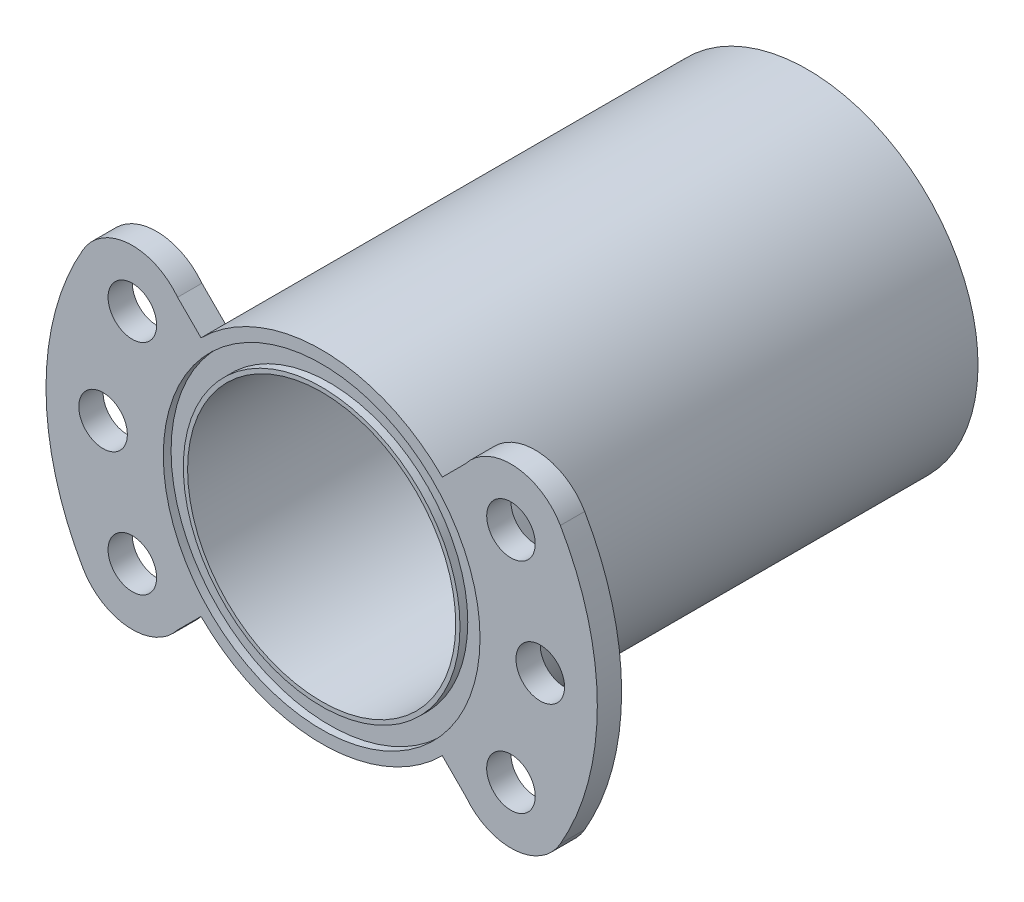
ISO-10303-21;
HEADER;
FILE_DESCRIPTION(('STEP AP214'),'2;1');
FILE_NAME('part.step','',(''),(''),'','','');
FILE_SCHEMA(('AUTOMOTIVE_DESIGN { 1 0 10303 214 1 1 1 1 }'));
ENDSEC;
DATA;
#1=APPLICATION_CONTEXT('core data for automotive mechanical design processes');
#2=APPLICATION_PROTOCOL_DEFINITION('international standard','automotive_design',2000,#1);
#3=PRODUCT_CONTEXT('',#1,'mechanical');
#4=PRODUCT('Part','Part','',(#3));
#5=PRODUCT_RELATED_PRODUCT_CATEGORY('part','',(#4));
#6=PRODUCT_DEFINITION_FORMATION('','',#4);
#7=PRODUCT_DEFINITION_CONTEXT('part definition',#1,'design');
#8=PRODUCT_DEFINITION('design','',#6,#7);
#9=PRODUCT_DEFINITION_SHAPE('','',#8);
#10=(LENGTH_UNIT() NAMED_UNIT(*) SI_UNIT(.MILLI.,.METRE.));
#11=(NAMED_UNIT(*) PLANE_ANGLE_UNIT() SI_UNIT($,.RADIAN.));
#12=(NAMED_UNIT(*) SI_UNIT($,.STERADIAN.) SOLID_ANGLE_UNIT());
#13=UNCERTAINTY_MEASURE_WITH_UNIT(LENGTH_MEASURE(1.E-05),#10,'distance_accuracy_value','');
#14=(GEOMETRIC_REPRESENTATION_CONTEXT(3) GLOBAL_UNCERTAINTY_ASSIGNED_CONTEXT((#13)) GLOBAL_UNIT_ASSIGNED_CONTEXT((#10,
#11,#12)) REPRESENTATION_CONTEXT('',''));
#15=CARTESIAN_POINT('',(0.,0.,0.));
#16=DIRECTION('',(0.,0.,1.));
#17=DIRECTION('',(1.,0.,0.));
#18=AXIS2_PLACEMENT_3D('',#15,#16,#17);
#19=CARTESIAN_POINT('',(0.,0.,254.));
#20=DIRECTION('',(0.,0.,-1.));
#21=DIRECTION('',(-1.,0.,0.));
#22=AXIS2_PLACEMENT_3D('',#19,#20,#21);
#23=CYLINDRICAL_SURFACE('',#22,17.526);
#24=CARTESIAN_POINT('',(0.,0.,127.));
#25=DIRECTION('',(0.,0.,1.));
#26=DIRECTION('',(1.,0.,0.));
#27=AXIS2_PLACEMENT_3D('',#24,#25,#26);
#28=CIRCLE('',#27,17.526);
#29=CARTESIAN_POINT('',(17.526,0.,127.));
#30=VERTEX_POINT('',#29);
#31=EDGE_CURVE('E51',#30,#30,#28,.T.);
#32=ORIENTED_EDGE('',*,*,#31,.T.);
#33=EDGE_LOOP('',(#32));
#34=FACE_BOUND('',#33,.T.);
#35=CARTESIAN_POINT('',(0.,0.,66.675));
#36=DIRECTION('',(0.,0.,-1.));
#37=DIRECTION('',(-1.,0.,0.));
#38=AXIS2_PLACEMENT_3D('',#35,#36,#37);
#39=CIRCLE('',#38,17.526);
#40=CARTESIAN_POINT('',(-17.526,0.,66.675));
#41=VERTEX_POINT('',#40);
#42=EDGE_CURVE('E46',#41,#41,#39,.T.);
#43=ORIENTED_EDGE('',*,*,#42,.T.);
#44=EDGE_LOOP('',(#43));
#45=FACE_BOUND('',#44,.T.);
#46=ADVANCED_FACE('F43',(#34,#45),#23,.F.);
#47=CARTESIAN_POINT('',(0.,0.,60.7476810056103));
#48=DIRECTION('',(0.,0.,1.));
#49=DIRECTION('',(1.,0.,0.));
#50=AXIS2_PLACEMENT_3D('',#47,#48,#49);
#51=CYLINDRICAL_SURFACE('',#50,22.3012);
#52=DIRECTION('',(0.,0.,1.));
#53=VECTOR('',#52,1.);
#54=CARTESIAN_POINT('',(-15.7693297485973,-15.7693297485976,60.7476810056103));
#55=LINE('',#54,#53);
#56=CARTESIAN_POINT('',(-15.7693297485973,-15.7693297485976,123.825));
#57=VERTEX_POINT('',#56);
#58=CARTESIAN_POINT('',(-15.7693297485973,-15.7693297485976,127.));
#59=VERTEX_POINT('',#58);
#60=EDGE_CURVE('E59',#57,#59,#55,.T.);
#61=ORIENTED_EDGE('',*,*,#60,.F.);
#62=CARTESIAN_POINT('',(0.,0.,123.825));
#63=DIRECTION('',(0.,0.,1.));
#64=DIRECTION('',(1.,0.,0.));
#65=AXIS2_PLACEMENT_3D('',#62,#63,#64);
#66=CIRCLE('',#65,22.3012);
#67=CARTESIAN_POINT('',(-15.7693297485975,15.7693297485974,123.825));
#68=VERTEX_POINT('',#67);
#69=EDGE_CURVE('E143',#68,#57,#66,.T.);
#70=ORIENTED_EDGE('',*,*,#69,.F.);
#71=DIRECTION('',(0.,0.,1.));
#72=VECTOR('',#71,1.);
#73=CARTESIAN_POINT('',(-15.7693297485975,15.7693297485974,60.7476810056103));
#74=LINE('',#73,#72);
#75=CARTESIAN_POINT('',(-15.7693297485975,15.7693297485974,127.));
#76=VERTEX_POINT('',#75);
#77=EDGE_CURVE('E12',#68,#76,#74,.T.);
#78=ORIENTED_EDGE('',*,*,#77,.T.);
#79=CARTESIAN_POINT('',(0.,0.,127.));
#80=DIRECTION('',(0.,0.,1.));
#81=DIRECTION('',(1.,0.,0.));
#82=AXIS2_PLACEMENT_3D('',#79,#80,#81);
#83=CIRCLE('',#82,22.3012);
#84=CARTESIAN_POINT('',(15.7693297485974,15.7693297485975,127.));
#85=VERTEX_POINT('',#84);
#86=EDGE_CURVE('E159',#85,#76,#83,.T.);
#87=ORIENTED_EDGE('',*,*,#86,.F.);
#88=DIRECTION('',(0.,0.,1.));
#89=VECTOR('',#88,1.);
#90=CARTESIAN_POINT('',(15.7693297485974,15.7693297485975,60.7476810056103));
#91=LINE('',#90,#89);
#92=CARTESIAN_POINT('',(15.7693297485974,15.7693297485975,123.825));
#93=VERTEX_POINT('',#92);
#94=EDGE_CURVE('E150',#93,#85,#91,.T.);
#95=ORIENTED_EDGE('',*,*,#94,.F.);
#96=CARTESIAN_POINT('',(15.7693297485976,-15.7693297485972,123.825));
#97=VERTEX_POINT('',#96);
#98=EDGE_CURVE('E134',#97,#93,#66,.T.);
#99=ORIENTED_EDGE('',*,*,#98,.F.);
#100=DIRECTION('',(0.,0.,1.));
#101=VECTOR('',#100,1.);
#102=CARTESIAN_POINT('',(15.7693297485976,-15.7693297485972,60.7476810056103));
#103=LINE('',#102,#101);
#104=CARTESIAN_POINT('',(15.7693297485976,-15.7693297485972,127.));
#105=VERTEX_POINT('',#104);
#106=EDGE_CURVE('E67',#97,#105,#103,.T.);
#107=ORIENTED_EDGE('',*,*,#106,.T.);
#108=EDGE_CURVE('E162',#59,#105,#83,.T.);
#109=ORIENTED_EDGE('',*,*,#108,.F.);
#110=EDGE_LOOP('',(#61,#70,#78,#87,#95,#99,#107,#109));
#111=FACE_BOUND('',#110,.T.);
#112=CARTESIAN_POINT('',(0.,0.,63.5));
#113=DIRECTION('',(0.,0.,-1.));
#114=DIRECTION('',(-1.,0.,0.));
#115=AXIS2_PLACEMENT_3D('',#112,#113,#114);
#116=CIRCLE('',#115,22.3012);
#117=CARTESIAN_POINT('',(-22.3012,0.,63.5));
#118=VERTEX_POINT('',#117);
#119=EDGE_CURVE('E144',#118,#118,#116,.F.);
#120=ORIENTED_EDGE('',*,*,#119,.T.);
#121=EDGE_LOOP('',(#120));
#122=FACE_BOUND('',#121,.T.);
#123=ADVANCED_FACE('F156',(#111,#122),#51,.T.);
#124=CARTESIAN_POINT('',(24.7466759131402,14.2875000000003,-6.34999999999999));
#125=DIRECTION('',(0.,0.,1.));
#126=DIRECTION('',(1.,0.,0.));
#127=AXIS2_PLACEMENT_3D('',#124,#125,#126);
#128=CYLINDRICAL_SURFACE('',#127,3.175);
#129=CARTESIAN_POINT('',(24.7466759131402,14.2875000000003,123.825));
#130=DIRECTION('',(0.,0.,1.));
#131=DIRECTION('',(1.,0.,0.));
#132=AXIS2_PLACEMENT_3D('',#129,#130,#131);
#133=CIRCLE('',#132,3.175);
#134=CARTESIAN_POINT('',(27.9216759131402,14.2875000000003,123.825));
#135=VERTEX_POINT('',#134);
#136=EDGE_CURVE('E408',#135,#135,#133,.F.);
#137=ORIENTED_EDGE('',*,*,#136,.T.);
#138=EDGE_LOOP('',(#137));
#139=FACE_BOUND('',#138,.T.);
#140=CARTESIAN_POINT('',(24.7466759131402,14.2875000000003,127.));
#141=DIRECTION('',(0.,0.,1.));
#142=DIRECTION('',(0.50000000000001,-0.866025403784433,0.));
#143=AXIS2_PLACEMENT_3D('',#140,#141,#142);
#144=CIRCLE('',#143,3.175);
#145=CARTESIAN_POINT('',(26.3341759131402,11.5378693429847,127.));
#146=VERTEX_POINT('',#145);
#147=EDGE_CURVE('E208',#146,#146,#144,.T.);
#148=ORIENTED_EDGE('',*,*,#147,.T.);
#149=EDGE_LOOP('',(#148));
#150=FACE_BOUND('',#149,.T.);
#151=ADVANCED_FACE('F263',(#139,#150),#128,.F.);
#152=CARTESIAN_POINT('',(28.575,2.99307237772328E-13,-6.34999999999999));
#153=DIRECTION('',(0.,0.,1.));
#154=DIRECTION('',(1.,0.,0.));
#155=AXIS2_PLACEMENT_3D('',#152,#153,#154);
#156=CYLINDRICAL_SURFACE('',#155,3.175);
#157=CARTESIAN_POINT('',(28.575,2.99307237772328E-13,123.825));
#158=DIRECTION('',(0.,0.,1.));
#159=DIRECTION('',(1.,0.,0.));
#160=AXIS2_PLACEMENT_3D('',#157,#158,#159);
#161=CIRCLE('',#160,3.175);
#162=CARTESIAN_POINT('',(31.75,2.99307237772328E-13,123.825));
#163=VERTEX_POINT('',#162);
#164=EDGE_CURVE('E406',#163,#163,#161,.F.);
#165=ORIENTED_EDGE('',*,*,#164,.T.);
#166=EDGE_LOOP('',(#165));
#167=FACE_BOUND('',#166,.T.);
#168=CARTESIAN_POINT('',(28.575,2.99307237772328E-13,127.));
#169=DIRECTION('',(0.,0.,1.));
#170=DIRECTION('',(0.,-1.,0.));
#171=AXIS2_PLACEMENT_3D('',#168,#169,#170);
#172=CIRCLE('',#171,3.175);
#173=CARTESIAN_POINT('',(28.575,-3.1749999999997,127.));
#174=VERTEX_POINT('',#173);
#175=EDGE_CURVE('E225',#174,#174,#172,.T.);
#176=ORIENTED_EDGE('',*,*,#175,.T.);
#177=EDGE_LOOP('',(#176));
#178=FACE_BOUND('',#177,.T.);
#179=ADVANCED_FACE('F329',(#167,#178),#156,.F.);
#180=CARTESIAN_POINT('',(24.7466759131405,-14.2874999999998,-6.34999999999999));
#181=DIRECTION('',(0.,0.,1.));
#182=DIRECTION('',(1.,0.,0.));
#183=AXIS2_PLACEMENT_3D('',#180,#181,#182);
#184=CYLINDRICAL_SURFACE('',#183,3.175);
#185=CARTESIAN_POINT('',(24.7466759131405,-14.2874999999998,123.825));
#186=DIRECTION('',(0.,0.,1.));
#187=DIRECTION('',(1.,0.,0.));
#188=AXIS2_PLACEMENT_3D('',#185,#186,#187);
#189=CIRCLE('',#188,3.175);
#190=CARTESIAN_POINT('',(27.9216759131405,-14.2874999999998,123.825));
#191=VERTEX_POINT('',#190);
#192=EDGE_CURVE('E403',#191,#191,#189,.F.);
#193=ORIENTED_EDGE('',*,*,#192,.T.);
#194=EDGE_LOOP('',(#193));
#195=FACE_BOUND('',#194,.T.);
#196=CARTESIAN_POINT('',(24.7466759131405,-14.2874999999998,127.));
#197=DIRECTION('',(0.,0.,1.));
#198=DIRECTION('',(-0.499999999999992,-0.866025403784443,0.));
#199=AXIS2_PLACEMENT_3D('',#196,#197,#198);
#200=CIRCLE('',#199,3.175);
#201=CARTESIAN_POINT('',(23.1591759131405,-17.0371306570154,127.));
#202=VERTEX_POINT('',#201);
#203=EDGE_CURVE('E235',#202,#202,#200,.T.);
#204=ORIENTED_EDGE('',*,*,#203,.T.);
#205=EDGE_LOOP('',(#204));
#206=FACE_BOUND('',#205,.T.);
#207=ADVANCED_FACE('F341',(#195,#206),#184,.F.);
#208=CARTESIAN_POINT('',(-24.7466759131403,-14.2875000000001,-6.34999999999999));
#209=DIRECTION('',(0.,0.,1.));
#210=DIRECTION('',(1.,0.,0.));
#211=AXIS2_PLACEMENT_3D('',#208,#209,#210);
#212=CYLINDRICAL_SURFACE('',#211,3.175);
#213=CARTESIAN_POINT('',(-24.7466759131403,-14.2875000000001,123.825));
#214=DIRECTION('',(0.,0.,1.));
#215=DIRECTION('',(1.,0.,0.));
#216=AXIS2_PLACEMENT_3D('',#213,#214,#215);
#217=CIRCLE('',#216,3.175);
#218=CARTESIAN_POINT('',(-21.5716759131403,-14.2875000000001,123.825));
#219=VERTEX_POINT('',#218);
#220=EDGE_CURVE('E400',#219,#219,#217,.F.);
#221=ORIENTED_EDGE('',*,*,#220,.T.);
#222=EDGE_LOOP('',(#221));
#223=FACE_BOUND('',#222,.T.);
#224=CARTESIAN_POINT('',(-24.7466759131403,-14.2875000000001,127.));
#225=DIRECTION('',(0.,0.,1.));
#226=DIRECTION('',(-0.500000000000004,0.866025403784436,0.));
#227=AXIS2_PLACEMENT_3D('',#224,#225,#226);
#228=CIRCLE('',#227,3.175);
#229=CARTESIAN_POINT('',(-26.3341759131403,-11.5378693429845,127.));
#230=VERTEX_POINT('',#229);
#231=EDGE_CURVE('E232',#230,#230,#228,.T.);
#232=ORIENTED_EDGE('',*,*,#231,.T.);
#233=EDGE_LOOP('',(#232));
#234=FACE_BOUND('',#233,.T.);
#235=ADVANCED_FACE('F337',(#223,#234),#212,.F.);
#236=CARTESIAN_POINT('',(-28.575,0.,-6.34999999999999));
#237=DIRECTION('',(0.,0.,1.));
#238=DIRECTION('',(1.,0.,0.));
#239=AXIS2_PLACEMENT_3D('',#236,#237,#238);
#240=CYLINDRICAL_SURFACE('',#239,3.175);
#241=CARTESIAN_POINT('',(-28.575,0.,123.825));
#242=DIRECTION('',(0.,0.,1.));
#243=DIRECTION('',(1.,0.,0.));
#244=AXIS2_PLACEMENT_3D('',#241,#242,#243);
#245=CIRCLE('',#244,3.175);
#246=CARTESIAN_POINT('',(-25.4,0.,123.825));
#247=VERTEX_POINT('',#246);
#248=EDGE_CURVE('E397',#247,#247,#245,.F.);
#249=ORIENTED_EDGE('',*,*,#248,.T.);
#250=EDGE_LOOP('',(#249));
#251=FACE_BOUND('',#250,.T.);
#252=CARTESIAN_POINT('',(-28.575,0.,127.));
#253=DIRECTION('',(0.,0.,1.));
#254=DIRECTION('',(0.,1.,0.));
#255=AXIS2_PLACEMENT_3D('',#252,#253,#254);
#256=CIRCLE('',#255,3.175);
#257=CARTESIAN_POINT('',(-28.575,3.1749999999999,127.));
#258=VERTEX_POINT('',#257);
#259=EDGE_CURVE('E229',#258,#258,#256,.T.);
#260=ORIENTED_EDGE('',*,*,#259,.T.);
#261=EDGE_LOOP('',(#260));
#262=FACE_BOUND('',#261,.T.);
#263=ADVANCED_FACE('F333',(#251,#262),#240,.F.);
#264=CARTESIAN_POINT('',(-24.7466759131404,14.2874999999999,-6.34999999999999));
#265=DIRECTION('',(0.,0.,1.));
#266=DIRECTION('',(1.,0.,0.));
#267=AXIS2_PLACEMENT_3D('',#264,#265,#266);
#268=CYLINDRICAL_SURFACE('',#267,3.175);
#269=CARTESIAN_POINT('',(-24.7466759131404,14.2874999999999,123.825));
#270=DIRECTION('',(0.,0.,1.));
#271=DIRECTION('',(1.,0.,0.));
#272=AXIS2_PLACEMENT_3D('',#269,#270,#271);
#273=CIRCLE('',#272,3.175);
#274=CARTESIAN_POINT('',(-21.5716759131404,14.2874999999999,123.825));
#275=VERTEX_POINT('',#274);
#276=EDGE_CURVE('E394',#275,#275,#273,.F.);
#277=ORIENTED_EDGE('',*,*,#276,.T.);
#278=EDGE_LOOP('',(#277));
#279=FACE_BOUND('',#278,.T.);
#280=CARTESIAN_POINT('',(-24.7466759131404,14.2874999999999,127.));
#281=DIRECTION('',(0.,0.,1.));
#282=DIRECTION('',(0.499999999999998,0.86602540378444,0.));
#283=AXIS2_PLACEMENT_3D('',#280,#281,#282);
#284=CIRCLE('',#283,3.175);
#285=CARTESIAN_POINT('',(-23.1591759131404,17.0371306570155,127.));
#286=VERTEX_POINT('',#285);
#287=EDGE_CURVE('E226',#286,#286,#284,.T.);
#288=ORIENTED_EDGE('',*,*,#287,.T.);
#289=EDGE_LOOP('',(#288));
#290=FACE_BOUND('',#289,.T.);
#291=ADVANCED_FACE('F325',(#279,#290),#268,.F.);
#292=CARTESIAN_POINT('',(24.7466759131405,-14.2874999999998,0.));
#293=DIRECTION('',(0.,0.,1.));
#294=DIRECTION('',(1.,0.,0.));
#295=AXIS2_PLACEMENT_3D('',#292,#293,#294);
#296=CYLINDRICAL_SURFACE('',#295,7.45957188537586);
#297=CARTESIAN_POINT('',(24.7466759131405,-14.2874999999998,123.825));
#298=DIRECTION('',(0.,0.,1.));
#299=DIRECTION('',(1.,0.,0.));
#300=AXIS2_PLACEMENT_3D('',#297,#298,#299);
#301=CIRCLE('',#300,7.45957188537586);
#302=CARTESIAN_POINT('',(31.206854667232,-18.0172859426875,123.825));
#303=VERTEX_POINT('',#302);
#304=CARTESIAN_POINT('',(18.828599640735,-18.8285996407346,123.825));
#305=VERTEX_POINT('',#304);
#306=EDGE_CURVE('E153',#303,#305,#301,.F.);
#307=ORIENTED_EDGE('',*,*,#306,.F.);
#308=DIRECTION('',(0.,0.,1.));
#309=VECTOR('',#308,1.);
#310=CARTESIAN_POINT('',(31.206854667232,-18.0172859426875,80.9002523478112));
#311=LINE('',#310,#309);
#312=CARTESIAN_POINT('',(31.206854667232,-18.0172859426875,127.));
#313=VERTEX_POINT('',#312);
#314=EDGE_CURVE('E182',#303,#313,#311,.T.);
#315=ORIENTED_EDGE('',*,*,#314,.T.);
#316=CARTESIAN_POINT('',(24.7466759131405,-14.2874999999998,127.));
#317=DIRECTION('',(0.,0.,1.));
#318=DIRECTION('',(1.,0.,0.));
#319=AXIS2_PLACEMENT_3D('',#316,#317,#318);
#320=CIRCLE('',#319,7.45957188537586);
#321=CARTESIAN_POINT('',(18.828599640735,-18.8285996407346,127.));
#322=VERTEX_POINT('',#321);
#323=EDGE_CURVE('E192',#322,#313,#320,.T.);
#324=ORIENTED_EDGE('',*,*,#323,.F.);
#325=DIRECTION('',(0.,0.,1.));
#326=VECTOR('',#325,1.);
#327=CARTESIAN_POINT('',(18.828599640735,-18.8285996407346,0.));
#328=LINE('',#327,#326);
#329=EDGE_CURVE('E220',#305,#322,#328,.T.);
#330=ORIENTED_EDGE('',*,*,#329,.F.);
#331=EDGE_LOOP('',(#307,#315,#324,#330));
#332=FACE_BOUND('',#331,.T.);
#333=ADVANCED_FACE('F316',(#332),#296,.T.);
#334=CARTESIAN_POINT('',(-24.7466759131403,-14.2875000000001,0.));
#335=DIRECTION('',(0.,0.,1.));
#336=DIRECTION('',(1.,0.,0.));
#337=AXIS2_PLACEMENT_3D('',#334,#335,#336);
#338=CYLINDRICAL_SURFACE('',#337,7.45957188537606);
#339=CARTESIAN_POINT('',(-24.7466759131403,-14.2875000000001,123.825));
#340=DIRECTION('',(0.,0.,1.));
#341=DIRECTION('',(1.,0.,0.));
#342=AXIS2_PLACEMENT_3D('',#339,#340,#341);
#343=CIRCLE('',#342,7.45957188537606);
#344=CARTESIAN_POINT('',(-18.8285996407345,-18.8285996407349,123.825));
#345=VERTEX_POINT('',#344);
#346=CARTESIAN_POINT('',(-31.2068546672318,-18.017285942688,123.825));
#347=VERTEX_POINT('',#346);
#348=EDGE_CURVE('E388',#345,#347,#343,.F.);
#349=ORIENTED_EDGE('',*,*,#348,.F.);
#350=DIRECTION('',(0.,0.,1.));
#351=VECTOR('',#350,1.);
#352=CARTESIAN_POINT('',(-18.8285996407345,-18.8285996407349,0.));
#353=LINE('',#352,#351);
#354=CARTESIAN_POINT('',(-18.8285996407345,-18.8285996407349,127.));
#355=VERTEX_POINT('',#354);
#356=EDGE_CURVE('E198',#345,#355,#353,.T.);
#357=ORIENTED_EDGE('',*,*,#356,.T.);
#358=CARTESIAN_POINT('',(-24.7466759131403,-14.2875000000001,127.));
#359=DIRECTION('',(0.,0.,1.));
#360=DIRECTION('',(1.,0.,0.));
#361=AXIS2_PLACEMENT_3D('',#358,#359,#360);
#362=CIRCLE('',#361,7.45957188537606);
#363=CARTESIAN_POINT('',(-31.2068546672318,-18.017285942688,127.));
#364=VERTEX_POINT('',#363);
#365=EDGE_CURVE('E217',#364,#355,#362,.T.);
#366=ORIENTED_EDGE('',*,*,#365,.F.);
#367=DIRECTION('',(0.,0.,1.));
#368=VECTOR('',#367,1.);
#369=CARTESIAN_POINT('',(-31.2068546672318,-18.017285942688,80.9002523478112));
#370=LINE('',#369,#368);
#371=EDGE_CURVE('E190',#347,#364,#370,.T.);
#372=ORIENTED_EDGE('',*,*,#371,.F.);
#373=EDGE_LOOP('',(#349,#357,#366,#372));
#374=FACE_BOUND('',#373,.T.);
#375=ADVANCED_FACE('F312',(#374),#338,.T.);
#376=CARTESIAN_POINT('',(0.,0.,0.));
#377=DIRECTION('',(-0.707106781186554,0.707106781186541,0.));
#378=DIRECTION('',(-0.707106781186541,-0.707106781186554,0.));
#379=AXIS2_PLACEMENT_3D('',#376,#377,#378);
#380=PLANE('',#379);
#381=ORIENTED_EDGE('',*,*,#356,.F.);
#382=DIRECTION('',(0.707106781186541,0.707106781186554,0.));
#383=VECTOR('',#382,1.);
#384=CARTESIAN_POINT('',(0.,0.,123.825));
#385=LINE('',#384,#383);
#386=EDGE_CURVE('E392',#345,#57,#385,.T.);
#387=ORIENTED_EDGE('',*,*,#386,.T.);
#388=ORIENTED_EDGE('',*,*,#60,.T.);
#389=DIRECTION('',(-0.707106781186542,-0.707106781186554,0.));
#390=VECTOR('',#389,1.);
#391=CARTESIAN_POINT('',(0.,0.,127.));
#392=LINE('',#391,#390);
#393=EDGE_CURVE('E215',#59,#355,#392,.T.);
#394=ORIENTED_EDGE('',*,*,#393,.T.);
#395=EDGE_LOOP('',(#381,#387,#388,#394));
#396=FACE_BOUND('',#395,.T.);
#397=ADVANCED_FACE('F315',(#396),#380,.F.);
#398=CARTESIAN_POINT('',(0.,0.,0.));
#399=DIRECTION('',(-0.707106781186539,-0.707106781186556,0.));
#400=DIRECTION('',(0.707106781186556,-0.707106781186539,0.));
#401=AXIS2_PLACEMENT_3D('',#398,#399,#400);
#402=PLANE('',#401);
#403=DIRECTION('',(-0.707106781186556,0.707106781186539,0.));
#404=VECTOR('',#403,1.);
#405=CARTESIAN_POINT('',(0.,0.,123.825));
#406=LINE('',#405,#404);
#407=EDGE_CURVE('E141',#305,#97,#406,.T.);
#408=ORIENTED_EDGE('',*,*,#407,.F.);
#409=ORIENTED_EDGE('',*,*,#329,.T.);
#410=DIRECTION('',(0.707106781186556,-0.707106781186539,0.));
#411=VECTOR('',#410,1.);
#412=CARTESIAN_POINT('',(0.,0.,127.));
#413=LINE('',#412,#411);
#414=EDGE_CURVE('E212',#105,#322,#413,.T.);
#415=ORIENTED_EDGE('',*,*,#414,.F.);
#416=ORIENTED_EDGE('',*,*,#106,.F.);
#417=EDGE_LOOP('',(#408,#409,#415,#416));
#418=FACE_BOUND('',#417,.T.);
#419=ADVANCED_FACE('F302',(#418),#402,.T.);
#420=CARTESIAN_POINT('',(24.7466759131402,14.2875000000003,0.));
#421=DIRECTION('',(0.,0.,1.));
#422=DIRECTION('',(1.,0.,0.));
#423=AXIS2_PLACEMENT_3D('',#420,#421,#422);
#424=CYLINDRICAL_SURFACE('',#423,7.45957188537567);
#425=CARTESIAN_POINT('',(24.7466759131402,14.2875000000003,123.825));
#426=DIRECTION('',(0.,0.,1.));
#427=DIRECTION('',(1.,0.,0.));
#428=AXIS2_PLACEMENT_3D('',#425,#426,#427);
#429=CIRCLE('',#428,7.45957188537567);
#430=CARTESIAN_POINT('',(18.8285996407348,18.8285996407349,123.825));
#431=VERTEX_POINT('',#430);
#432=CARTESIAN_POINT('',(31.2068546672316,18.0172859426882,123.825));
#433=VERTEX_POINT('',#432);
#434=EDGE_CURVE('E376',#431,#433,#429,.F.);
#435=ORIENTED_EDGE('',*,*,#434,.F.);
#436=DIRECTION('',(0.,0.,1.));
#437=VECTOR('',#436,1.);
#438=CARTESIAN_POINT('',(18.8285996407348,18.8285996407349,0.));
#439=LINE('',#438,#437);
#440=CARTESIAN_POINT('',(18.8285996407348,18.8285996407349,127.));
#441=VERTEX_POINT('',#440);
#442=EDGE_CURVE('E152',#431,#441,#439,.T.);
#443=ORIENTED_EDGE('',*,*,#442,.T.);
#444=CARTESIAN_POINT('',(24.7466759131402,14.2875000000003,127.));
#445=DIRECTION('',(0.,0.,1.));
#446=DIRECTION('',(1.,0.,0.));
#447=AXIS2_PLACEMENT_3D('',#444,#445,#446);
#448=CIRCLE('',#447,7.45957188537567);
#449=CARTESIAN_POINT('',(31.2068546672316,18.0172859426882,127.));
#450=VERTEX_POINT('',#449);
#451=EDGE_CURVE('E203',#450,#441,#448,.T.);
#452=ORIENTED_EDGE('',*,*,#451,.F.);
#453=DIRECTION('',(0.,0.,1.));
#454=VECTOR('',#453,1.);
#455=CARTESIAN_POINT('',(31.2068546672316,18.0172859426882,80.9002523478112));
#456=LINE('',#455,#454);
#457=EDGE_CURVE('E183',#433,#450,#456,.T.);
#458=ORIENTED_EDGE('',*,*,#457,.F.);
#459=EDGE_LOOP('',(#435,#443,#452,#458));
#460=FACE_BOUND('',#459,.T.);
#461=ADVANCED_FACE('F298',(#460),#424,.T.);
#462=CARTESIAN_POINT('',(-24.7466759131404,14.2874999999999,0.));
#463=DIRECTION('',(0.,0.,1.));
#464=DIRECTION('',(1.,0.,0.));
#465=AXIS2_PLACEMENT_3D('',#462,#463,#464);
#466=CYLINDRICAL_SURFACE('',#465,7.45957188537586);
#467=CARTESIAN_POINT('',(-24.7466759131404,14.2874999999999,123.825));
#468=DIRECTION('',(0.,0.,1.));
#469=DIRECTION('',(1.,0.,0.));
#470=AXIS2_PLACEMENT_3D('',#467,#468,#469);
#471=CIRCLE('',#470,7.45957188537586);
#472=CARTESIAN_POINT('',(-31.2068546672319,18.0172859426878,123.825));
#473=VERTEX_POINT('',#472);
#474=CARTESIAN_POINT('',(-18.8285996407349,18.8285996407347,123.825));
#475=VERTEX_POINT('',#474);
#476=EDGE_CURVE('E386',#473,#475,#471,.F.);
#477=ORIENTED_EDGE('',*,*,#476,.F.);
#478=DIRECTION('',(0.,0.,1.));
#479=VECTOR('',#478,1.);
#480=CARTESIAN_POINT('',(-31.2068546672319,18.0172859426878,80.9002523478112));
#481=LINE('',#480,#479);
#482=CARTESIAN_POINT('',(-31.2068546672319,18.0172859426878,127.));
#483=VERTEX_POINT('',#482);
#484=EDGE_CURVE('E189',#473,#483,#481,.T.);
#485=ORIENTED_EDGE('',*,*,#484,.T.);
#486=CARTESIAN_POINT('',(-24.7466759131404,14.2874999999999,127.));
#487=DIRECTION('',(0.,0.,1.));
#488=DIRECTION('',(1.,0.,0.));
#489=AXIS2_PLACEMENT_3D('',#486,#487,#488);
#490=CIRCLE('',#489,7.45957188537586);
#491=CARTESIAN_POINT('',(-18.8285996407349,18.8285996407347,127.));
#492=VERTEX_POINT('',#491);
#493=EDGE_CURVE('E194',#492,#483,#490,.T.);
#494=ORIENTED_EDGE('',*,*,#493,.F.);
#495=DIRECTION('',(0.,0.,1.));
#496=VECTOR('',#495,1.);
#497=CARTESIAN_POINT('',(-18.8285996407349,18.8285996407347,0.));
#498=LINE('',#497,#496);
#499=EDGE_CURVE('E206',#475,#492,#498,.T.);
#500=ORIENTED_EDGE('',*,*,#499,.F.);
#501=EDGE_LOOP('',(#477,#485,#494,#500));
#502=FACE_BOUND('',#501,.T.);
#503=ADVANCED_FACE('F301',(#502),#466,.T.);
#504=CARTESIAN_POINT('',(0.,0.,0.));
#505=DIRECTION('',(0.707106781186549,-0.707106781186546,0.));
#506=DIRECTION('',(0.707106781186546,0.707106781186549,0.));
#507=AXIS2_PLACEMENT_3D('',#504,#505,#506);
#508=PLANE('',#507);
#509=ORIENTED_EDGE('',*,*,#442,.F.);
#510=DIRECTION('',(-0.707106781186546,-0.707106781186549,0.));
#511=VECTOR('',#510,1.);
#512=CARTESIAN_POINT('',(0.,0.,123.825));
#513=LINE('',#512,#511);
#514=EDGE_CURVE('E138',#431,#93,#513,.T.);
#515=ORIENTED_EDGE('',*,*,#514,.T.);
#516=ORIENTED_EDGE('',*,*,#94,.T.);
#517=DIRECTION('',(0.707106781186546,0.707106781186549,0.));
#518=VECTOR('',#517,1.);
#519=CARTESIAN_POINT('',(0.,0.,127.));
#520=LINE('',#519,#518);
#521=EDGE_CURVE('E201',#85,#441,#520,.T.);
#522=ORIENTED_EDGE('',*,*,#521,.T.);
#523=EDGE_LOOP('',(#509,#515,#516,#522));
#524=FACE_BOUND('',#523,.T.);
#525=ADVANCED_FACE('F148',(#524),#508,.F.);
#526=CARTESIAN_POINT('',(0.,0.,0.));
#527=DIRECTION('',(0.707106781186544,0.707106781186551,0.));
#528=DIRECTION('',(-0.707106781186551,0.707106781186544,0.));
#529=AXIS2_PLACEMENT_3D('',#526,#527,#528);
#530=PLANE('',#529);
#531=DIRECTION('',(0.707106781186551,-0.707106781186544,0.));
#532=VECTOR('',#531,1.);
#533=CARTESIAN_POINT('',(0.,0.,123.825));
#534=LINE('',#533,#532);
#535=EDGE_CURVE('E390',#475,#68,#534,.T.);
#536=ORIENTED_EDGE('',*,*,#535,.F.);
#537=ORIENTED_EDGE('',*,*,#499,.T.);
#538=DIRECTION('',(-0.707106781186551,0.707106781186544,0.));
#539=VECTOR('',#538,1.);
#540=CARTESIAN_POINT('',(0.,0.,127.));
#541=LINE('',#540,#539);
#542=EDGE_CURVE('E197',#76,#492,#541,.T.);
#543=ORIENTED_EDGE('',*,*,#542,.F.);
#544=ORIENTED_EDGE('',*,*,#77,.F.);
#545=EDGE_LOOP('',(#536,#537,#543,#544));
#546=FACE_BOUND('',#545,.T.);
#547=ADVANCED_FACE('F296',(#546),#530,.T.);
#548=CARTESIAN_POINT('',(0.,0.,80.9002523478112));
#549=DIRECTION('',(0.,0.,1.));
#550=DIRECTION('',(1.,0.,0.));
#551=AXIS2_PLACEMENT_3D('',#548,#549,#550);
#552=CYLINDRICAL_SURFACE('',#551,36.0345718853757);
#553=CARTESIAN_POINT('',(0.,0.,123.825));
#554=DIRECTION('',(0.,0.,1.));
#555=DIRECTION('',(1.,0.,0.));
#556=AXIS2_PLACEMENT_3D('',#553,#554,#555);
#557=CIRCLE('',#556,36.0345718853757);
#558=EDGE_CURVE('E384',#347,#473,#557,.F.);
#559=ORIENTED_EDGE('',*,*,#558,.F.);
#560=ORIENTED_EDGE('',*,*,#371,.T.);
#561=CARTESIAN_POINT('',(0.,0.,127.));
#562=DIRECTION('',(0.,0.,1.));
#563=DIRECTION('',(1.,0.,0.));
#564=AXIS2_PLACEMENT_3D('',#561,#562,#563);
#565=CIRCLE('',#564,36.0345718853757);
#566=EDGE_CURVE('E185',#483,#364,#565,.T.);
#567=ORIENTED_EDGE('',*,*,#566,.F.);
#568=ORIENTED_EDGE('',*,*,#484,.F.);
#569=EDGE_LOOP('',(#559,#560,#567,#568));
#570=FACE_BOUND('',#569,.T.);
#571=ADVANCED_FACE('F292',(#570),#552,.T.);
#572=CARTESIAN_POINT('',(0.,0.,80.9002523478112));
#573=DIRECTION('',(0.,0.,1.));
#574=DIRECTION('',(1.,0.,0.));
#575=AXIS2_PLACEMENT_3D('',#572,#573,#574);
#576=CYLINDRICAL_SURFACE('',#575,36.0345718853757);
#577=CARTESIAN_POINT('',(0.,0.,123.825));
#578=DIRECTION('',(0.,0.,1.));
#579=DIRECTION('',(1.,0.,0.));
#580=AXIS2_PLACEMENT_3D('',#577,#578,#579);
#581=CIRCLE('',#580,36.0345718853757);
#582=EDGE_CURVE('E378',#433,#303,#581,.F.);
#583=ORIENTED_EDGE('',*,*,#582,.F.);
#584=ORIENTED_EDGE('',*,*,#457,.T.);
#585=CARTESIAN_POINT('',(0.,0.,127.));
#586=DIRECTION('',(0.,0.,1.));
#587=DIRECTION('',(1.,0.,0.));
#588=AXIS2_PLACEMENT_3D('',#585,#586,#587);
#589=CIRCLE('',#588,36.0345718853757);
#590=EDGE_CURVE('E177',#313,#450,#589,.T.);
#591=ORIENTED_EDGE('',*,*,#590,.F.);
#592=ORIENTED_EDGE('',*,*,#314,.F.);
#593=EDGE_LOOP('',(#583,#584,#591,#592));
#594=FACE_BOUND('',#593,.T.);
#595=ADVANCED_FACE('F289',(#594),#576,.T.);
#596=CARTESIAN_POINT('',(0.,0.,127.));
#597=DIRECTION('',(0.,0.,1.));
#598=DIRECTION('',(1.,0.,0.));
#599=AXIS2_PLACEMENT_3D('',#596,#597,#598);
#600=PLANE('',#599);
#601=ORIENTED_EDGE('',*,*,#521,.F.);
#602=ORIENTED_EDGE('',*,*,#86,.T.);
#603=ORIENTED_EDGE('',*,*,#542,.T.);
#604=ORIENTED_EDGE('',*,*,#493,.T.);
#605=ORIENTED_EDGE('',*,*,#566,.T.);
#606=ORIENTED_EDGE('',*,*,#365,.T.);
#607=ORIENTED_EDGE('',*,*,#393,.F.);
#608=ORIENTED_EDGE('',*,*,#108,.T.);
#609=ORIENTED_EDGE('',*,*,#414,.T.);
#610=ORIENTED_EDGE('',*,*,#323,.T.);
#611=ORIENTED_EDGE('',*,*,#590,.T.);
#612=ORIENTED_EDGE('',*,*,#451,.T.);
#613=EDGE_LOOP('',(#601,#602,#603,#604,#605,#606,#607,#608,#609,#610,#611,#612));
#614=FACE_BOUND('',#613,.T.);
#615=ORIENTED_EDGE('',*,*,#203,.F.);
#616=EDGE_LOOP('',(#615));
#617=FACE_BOUND('',#616,.T.);
#618=ORIENTED_EDGE('',*,*,#175,.F.);
#619=EDGE_LOOP('',(#618));
#620=FACE_BOUND('',#619,.T.);
#621=ORIENTED_EDGE('',*,*,#147,.F.);
#622=EDGE_LOOP('',(#621));
#623=FACE_BOUND('',#622,.T.);
#624=CARTESIAN_POINT('',(0.,0.,127.));
#625=DIRECTION('',(0.,0.,1.));
#626=DIRECTION('',(1.,0.,0.));
#627=AXIS2_PLACEMENT_3D('',#624,#625,#626);
#628=CIRCLE('',#627,20.701);
#629=CARTESIAN_POINT('',(20.701,0.,127.));
#630=VERTEX_POINT('',#629);
#631=EDGE_CURVE('E171',#630,#630,#628,.T.);
#632=ORIENTED_EDGE('',*,*,#631,.F.);
#633=EDGE_LOOP('',(#632));
#634=FACE_BOUND('',#633,.T.);
#635=ORIENTED_EDGE('',*,*,#231,.F.);
#636=EDGE_LOOP('',(#635));
#637=FACE_BOUND('',#636,.T.);
#638=ORIENTED_EDGE('',*,*,#259,.F.);
#639=EDGE_LOOP('',(#638));
#640=FACE_BOUND('',#639,.T.);
#641=ORIENTED_EDGE('',*,*,#287,.F.);
#642=EDGE_LOOP('',(#641));
#643=FACE_BOUND('',#642,.T.);
#644=ADVANCED_FACE('F271',(#614,#617,#620,#623,#634,#637,#640,#643),#600,.T.);
#645=CARTESIAN_POINT('',(0.,0.,125.984));
#646=DIRECTION('',(0.,0.,1.));
#647=DIRECTION('',(1.,0.,0.));
#648=AXIS2_PLACEMENT_3D('',#645,#646,#647);
#649=CYLINDRICAL_SURFACE('',#648,20.701);
#650=CARTESIAN_POINT('',(0.,0.,125.984));
#651=DIRECTION('',(0.,0.,1.));
#652=DIRECTION('',(1.,0.,0.));
#653=AXIS2_PLACEMENT_3D('',#650,#651,#652);
#654=CIRCLE('',#653,20.701);
#655=CARTESIAN_POINT('',(20.701,0.,125.984));
#656=VERTEX_POINT('',#655);
#657=EDGE_CURVE('E174',#656,#656,#654,.T.);
#658=ORIENTED_EDGE('',*,*,#657,.F.);
#659=EDGE_LOOP('',(#658));
#660=FACE_BOUND('',#659,.T.);
#661=ORIENTED_EDGE('',*,*,#631,.T.);
#662=EDGE_LOOP('',(#661));
#663=FACE_BOUND('',#662,.T.);
#664=ADVANCED_FACE('F281',(#660,#663),#649,.F.);
#665=CARTESIAN_POINT('',(0.,0.,125.984));
#666=DIRECTION('',(0.,0.,1.));
#667=DIRECTION('',(1.,0.,0.));
#668=AXIS2_PLACEMENT_3D('',#665,#666,#667);
#669=PLANE('',#668);
#670=CARTESIAN_POINT('',(0.,0.,125.984));
#671=DIRECTION('',(0.,0.,1.));
#672=DIRECTION('',(1.,0.,0.));
#673=AXIS2_PLACEMENT_3D('',#670,#671,#672);
#674=CIRCLE('',#673,18.0848);
#675=CARTESIAN_POINT('',(18.0848,0.,125.984));
#676=VERTEX_POINT('',#675);
#677=EDGE_CURVE('E168',#676,#676,#674,.T.);
#678=ORIENTED_EDGE('',*,*,#677,.F.);
#679=EDGE_LOOP('',(#678));
#680=FACE_BOUND('',#679,.T.);
#681=ORIENTED_EDGE('',*,*,#657,.T.);
#682=EDGE_LOOP('',(#681));
#683=FACE_BOUND('',#682,.T.);
#684=ADVANCED_FACE('F275',(#680,#683),#669,.T.);
#685=CARTESIAN_POINT('',(0.,0.,125.984));
#686=DIRECTION('',(0.,0.,1.));
#687=DIRECTION('',(1.,0.,0.));
#688=AXIS2_PLACEMENT_3D('',#685,#686,#687);
#689=CYLINDRICAL_SURFACE('',#688,18.0848);
#690=ORIENTED_EDGE('',*,*,#677,.T.);
#691=EDGE_LOOP('',(#690));
#692=FACE_BOUND('',#691,.T.);
#693=CARTESIAN_POINT('',(0.,0.,127.));
#694=DIRECTION('',(0.,0.,1.));
#695=DIRECTION('',(1.,0.,0.));
#696=AXIS2_PLACEMENT_3D('',#693,#694,#695);
#697=CIRCLE('',#696,18.0848);
#698=CARTESIAN_POINT('',(18.0848,0.,127.));
#699=VERTEX_POINT('',#698);
#700=EDGE_CURVE('E167',#699,#699,#697,.T.);
#701=ORIENTED_EDGE('',*,*,#700,.F.);
#702=EDGE_LOOP('',(#701));
#703=FACE_BOUND('',#702,.T.);
#704=ADVANCED_FACE('F270',(#692,#703),#689,.T.);
#705=ORIENTED_EDGE('',*,*,#31,.F.);
#706=EDGE_LOOP('',(#705));
#707=FACE_BOUND('',#706,.T.);
#708=ORIENTED_EDGE('',*,*,#700,.T.);
#709=EDGE_LOOP('',(#708));
#710=FACE_BOUND('',#709,.T.);
#711=ADVANCED_FACE('F267',(#707,#710),#600,.T.);
#712=CARTESIAN_POINT('',(0.,0.,123.825));
#713=DIRECTION('',(0.,0.,1.));
#714=DIRECTION('',(1.,0.,0.));
#715=AXIS2_PLACEMENT_3D('',#712,#713,#714);
#716=PLANE('',#715);
#717=ORIENTED_EDGE('',*,*,#164,.F.);
#718=EDGE_LOOP('',(#717));
#719=FACE_BOUND('',#718,.T.);
#720=ORIENTED_EDGE('',*,*,#407,.T.);
#721=ORIENTED_EDGE('',*,*,#98,.T.);
#722=ORIENTED_EDGE('',*,*,#514,.F.);
#723=ORIENTED_EDGE('',*,*,#434,.T.);
#724=ORIENTED_EDGE('',*,*,#582,.T.);
#725=ORIENTED_EDGE('',*,*,#306,.T.);
#726=EDGE_LOOP('',(#720,#721,#722,#723,#724,#725));
#727=FACE_BOUND('',#726,.T.);
#728=ORIENTED_EDGE('',*,*,#192,.F.);
#729=EDGE_LOOP('',(#728));
#730=FACE_BOUND('',#729,.T.);
#731=ORIENTED_EDGE('',*,*,#136,.F.);
#732=EDGE_LOOP('',(#731));
#733=FACE_BOUND('',#732,.T.);
#734=ADVANCED_FACE('F136',(#719,#727,#730,#733),#716,.F.);
#735=ORIENTED_EDGE('',*,*,#248,.F.);
#736=EDGE_LOOP('',(#735));
#737=FACE_BOUND('',#736,.T.);
#738=ORIENTED_EDGE('',*,*,#348,.T.);
#739=ORIENTED_EDGE('',*,*,#558,.T.);
#740=ORIENTED_EDGE('',*,*,#476,.T.);
#741=ORIENTED_EDGE('',*,*,#535,.T.);
#742=ORIENTED_EDGE('',*,*,#69,.T.);
#743=ORIENTED_EDGE('',*,*,#386,.F.);
#744=EDGE_LOOP('',(#738,#739,#740,#741,#742,#743));
#745=FACE_BOUND('',#744,.T.);
#746=ORIENTED_EDGE('',*,*,#276,.F.);
#747=EDGE_LOOP('',(#746));
#748=FACE_BOUND('',#747,.T.);
#749=ORIENTED_EDGE('',*,*,#220,.F.);
#750=EDGE_LOOP('',(#749));
#751=FACE_BOUND('',#750,.T.);
#752=ADVANCED_FACE('F254',(#737,#745,#748,#751),#716,.F.);
#753=CARTESIAN_POINT('',(0.,0.,63.5));
#754=DIRECTION('',(0.,0.,-1.));
#755=DIRECTION('',(-1.,0.,0.));
#756=AXIS2_PLACEMENT_3D('',#753,#754,#755);
#757=PLANE('',#756);
#758=ORIENTED_EDGE('',*,*,#119,.F.);
#759=EDGE_LOOP('',(#758));
#760=FACE_BOUND('',#759,.T.);
#761=ADVANCED_FACE('F249',(#760),#757,.T.);
#762=CARTESIAN_POINT('',(0.,0.,66.675));
#763=DIRECTION('',(0.,0.,-1.));
#764=DIRECTION('',(-1.,0.,0.));
#765=AXIS2_PLACEMENT_3D('',#762,#763,#764);
#766=PLANE('',#765);
#767=ORIENTED_EDGE('',*,*,#42,.F.);
#768=EDGE_LOOP('',(#767));
#769=FACE_BOUND('',#768,.T.);
#770=ADVANCED_FACE('F247',(#769),#766,.F.);
#771=CLOSED_SHELL('',(#46,#123,#151,#179,#207,#235,#263,#291,#333,#375,#397,#419,#461,#503,#525,
#547,#571,#595,#644,#664,#684,#704,#711,#734,#752,#761,#770));
#772=MANIFOLD_SOLID_BREP('B2',#771);
#773=ADVANCED_BREP_SHAPE_REPRESENTATION('',(#18,#772),#14);
#774=SHAPE_DEFINITION_REPRESENTATION(#9,#773);
ENDSEC;
END-ISO-10303-21;
